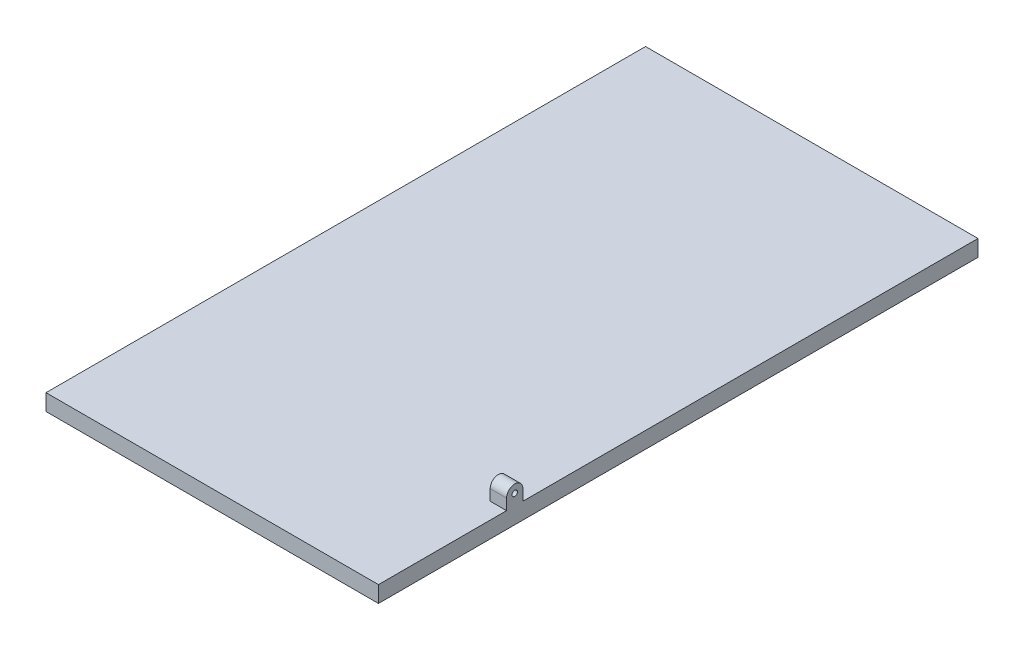
ISO-10303-21;
HEADER;
FILE_DESCRIPTION(('STEP AP214'),'2;1');
FILE_NAME('part.step','',(''),(''),'','','');
FILE_SCHEMA(('AUTOMOTIVE_DESIGN { 1 0 10303 214 1 1 1 1 }'));
ENDSEC;
DATA;
#1=APPLICATION_CONTEXT('core data for automotive mechanical design processes');
#2=APPLICATION_PROTOCOL_DEFINITION('international standard','automotive_design',2000,#1);
#3=PRODUCT_CONTEXT('',#1,'mechanical');
#4=PRODUCT('Part','Part','',(#3));
#5=PRODUCT_RELATED_PRODUCT_CATEGORY('part','',(#4));
#6=PRODUCT_DEFINITION_FORMATION('','',#4);
#7=PRODUCT_DEFINITION_CONTEXT('part definition',#1,'design');
#8=PRODUCT_DEFINITION('design','',#6,#7);
#9=PRODUCT_DEFINITION_SHAPE('','',#8);
#10=(LENGTH_UNIT() NAMED_UNIT(*) SI_UNIT(.MILLI.,.METRE.));
#11=(NAMED_UNIT(*) PLANE_ANGLE_UNIT() SI_UNIT($,.RADIAN.));
#12=(NAMED_UNIT(*) SI_UNIT($,.STERADIAN.) SOLID_ANGLE_UNIT());
#13=UNCERTAINTY_MEASURE_WITH_UNIT(LENGTH_MEASURE(1.E-05),#10,'distance_accuracy_value','');
#14=(GEOMETRIC_REPRESENTATION_CONTEXT(3) GLOBAL_UNCERTAINTY_ASSIGNED_CONTEXT((#13)) GLOBAL_UNIT_ASSIGNED_CONTEXT((#10,
#11,#12)) REPRESENTATION_CONTEXT('',''));
#15=CARTESIAN_POINT('',(0.,0.,0.));
#16=DIRECTION('',(0.,0.,1.));
#17=DIRECTION('',(1.,0.,0.));
#18=AXIS2_PLACEMENT_3D('',#15,#16,#17);
#19=CARTESIAN_POINT('',(0.,3.,0.));
#20=DIRECTION('',(0.,-1.,0.));
#21=DIRECTION('',(0.,0.,-1.));
#22=AXIS2_PLACEMENT_3D('',#19,#20,#21);
#23=PLANE('',#22);
#24=DIRECTION('',(1.,0.,0.));
#25=VECTOR('',#24,1.);
#26=CARTESIAN_POINT('',(58.,3.,-13.5));
#27=LINE('',#26,#25);
#28=CARTESIAN_POINT('',(58.,3.,-13.5));
#29=VERTEX_POINT('',#28);
#30=CARTESIAN_POINT('',(61.,3.,-13.5));
#31=VERTEX_POINT('',#30);
#32=EDGE_CURVE('E127',#29,#31,#27,.T.);
#33=ORIENTED_EDGE('',*,*,#32,.F.);
#34=DIRECTION('',(0.,0.,-1.));
#35=VECTOR('',#34,1.);
#36=CARTESIAN_POINT('',(58.,3.,-13.5));
#37=LINE('',#36,#35);
#38=CARTESIAN_POINT('',(58.,3.,-16.5));
#39=VERTEX_POINT('',#38);
#40=EDGE_CURVE('E153',#29,#39,#37,.T.);
#41=ORIENTED_EDGE('',*,*,#40,.T.);
#42=DIRECTION('',(1.,0.,0.));
#43=VECTOR('',#42,1.);
#44=CARTESIAN_POINT('',(58.,3.,-16.5));
#45=LINE('',#44,#43);
#46=CARTESIAN_POINT('',(61.,3.,-16.5));
#47=VERTEX_POINT('',#46);
#48=EDGE_CURVE('E124',#39,#47,#45,.T.);
#49=ORIENTED_EDGE('',*,*,#48,.T.);
#50=DIRECTION('',(0.,0.,-1.));
#51=VECTOR('',#50,1.);
#52=CARTESIAN_POINT('',(61.,3.,0.));
#53=LINE('',#52,#51);
#54=CARTESIAN_POINT('',(61.,3.,-100.));
#55=VERTEX_POINT('',#54);
#56=EDGE_CURVE('E107',#47,#55,#53,.T.);
#57=ORIENTED_EDGE('',*,*,#56,.T.);
#58=DIRECTION('',(-1.,0.,0.));
#59=VECTOR('',#58,1.);
#60=CARTESIAN_POINT('',(0.,3.,-100.));
#61=LINE('',#60,#59);
#62=CARTESIAN_POINT('',(0.,3.,-100.));
#63=VERTEX_POINT('',#62);
#64=EDGE_CURVE('E61',#55,#63,#61,.T.);
#65=ORIENTED_EDGE('',*,*,#64,.T.);
#66=DIRECTION('',(0.,0.,1.));
#67=VECTOR('',#66,1.);
#68=CARTESIAN_POINT('',(0.,3.,0.));
#69=LINE('',#68,#67);
#70=CARTESIAN_POINT('',(0.,3.,10.));
#71=VERTEX_POINT('',#70);
#72=EDGE_CURVE('E81',#63,#71,#69,.T.);
#73=ORIENTED_EDGE('',*,*,#72,.T.);
#74=DIRECTION('',(-1.,0.,0.));
#75=VECTOR('',#74,1.);
#76=CARTESIAN_POINT('',(0.,3.,10.));
#77=LINE('',#76,#75);
#78=CARTESIAN_POINT('',(61.,3.,10.));
#79=VERTEX_POINT('',#78);
#80=EDGE_CURVE('E95',#79,#71,#77,.T.);
#81=ORIENTED_EDGE('',*,*,#80,.F.);
#82=EDGE_CURVE('E104',#79,#31,#53,.T.);
#83=ORIENTED_EDGE('',*,*,#82,.T.);
#84=EDGE_LOOP('',(#33,#41,#49,#57,#65,#73,#81,#83));
#85=FACE_BOUND('',#84,.T.);
#86=ADVANCED_FACE('F35',(#85),#23,.F.);
#87=CARTESIAN_POINT('',(0.,3.,0.));
#88=DIRECTION('',(1.,0.,0.));
#89=DIRECTION('',(0.,0.,-1.));
#90=AXIS2_PLACEMENT_3D('',#87,#88,#89);
#91=PLANE('',#90);
#92=DIRECTION('',(0.,0.,1.));
#93=VECTOR('',#92,1.);
#94=CARTESIAN_POINT('',(0.,0.,0.));
#95=LINE('',#94,#93);
#96=CARTESIAN_POINT('',(0.,0.,-100.));
#97=VERTEX_POINT('',#96);
#98=CARTESIAN_POINT('',(0.,0.,10.));
#99=VERTEX_POINT('',#98);
#100=EDGE_CURVE('E88',#97,#99,#95,.T.);
#101=ORIENTED_EDGE('',*,*,#100,.T.);
#102=DIRECTION('',(0.,-1.,0.));
#103=VECTOR('',#102,1.);
#104=CARTESIAN_POINT('',(0.,0.,10.));
#105=LINE('',#104,#103);
#106=EDGE_CURVE('E116',#71,#99,#105,.T.);
#107=ORIENTED_EDGE('',*,*,#106,.F.);
#108=ORIENTED_EDGE('',*,*,#72,.F.);
#109=DIRECTION('',(0.,-1.,0.));
#110=VECTOR('',#109,1.);
#111=CARTESIAN_POINT('',(0.,3.,-100.));
#112=LINE('',#111,#110);
#113=EDGE_CURVE('E44',#63,#97,#112,.T.);
#114=ORIENTED_EDGE('',*,*,#113,.T.);
#115=EDGE_LOOP('',(#101,#107,#108,#114));
#116=FACE_BOUND('',#115,.T.);
#117=ADVANCED_FACE('F37',(#116),#91,.F.);
#118=CARTESIAN_POINT('',(61.,3.,0.));
#119=DIRECTION('',(-1.,0.,0.));
#120=DIRECTION('',(0.,0.,1.));
#121=AXIS2_PLACEMENT_3D('',#118,#119,#120);
#122=PLANE('',#121);
#123=DIRECTION('',(0.,0.,-1.));
#124=VECTOR('',#123,1.);
#125=CARTESIAN_POINT('',(61.,0.,0.));
#126=LINE('',#125,#124);
#127=CARTESIAN_POINT('',(61.,0.,10.));
#128=VERTEX_POINT('',#127);
#129=CARTESIAN_POINT('',(61.,0.,-100.));
#130=VERTEX_POINT('',#129);
#131=EDGE_CURVE('E82',#128,#130,#126,.T.);
#132=ORIENTED_EDGE('',*,*,#131,.T.);
#133=DIRECTION('',(0.,-1.,0.));
#134=VECTOR('',#133,1.);
#135=CARTESIAN_POINT('',(61.,3.,-100.));
#136=LINE('',#135,#134);
#137=EDGE_CURVE('E11',#55,#130,#136,.T.);
#138=ORIENTED_EDGE('',*,*,#137,.F.);
#139=ORIENTED_EDGE('',*,*,#56,.F.);
#140=DIRECTION('',(0.,1.,0.));
#141=VECTOR('',#140,1.);
#142=CARTESIAN_POINT('',(61.,3.,-16.5));
#143=LINE('',#142,#141);
#144=CARTESIAN_POINT('',(61.,5.,-16.5));
#145=VERTEX_POINT('',#144);
#146=EDGE_CURVE('E52',#47,#145,#143,.T.);
#147=ORIENTED_EDGE('',*,*,#146,.T.);
#148=CARTESIAN_POINT('',(61.,5.,-15.));
#149=DIRECTION('',(1.,0.,0.));
#150=DIRECTION('',(0.,0.,1.));
#151=AXIS2_PLACEMENT_3D('',#148,#149,#150);
#152=CIRCLE('',#151,1.5);
#153=CARTESIAN_POINT('',(61.,5.,-13.5));
#154=VERTEX_POINT('',#153);
#155=EDGE_CURVE('E141',#145,#154,#152,.T.);
#156=ORIENTED_EDGE('',*,*,#155,.T.);
#157=DIRECTION('',(0.,-1.,0.));
#158=VECTOR('',#157,1.);
#159=CARTESIAN_POINT('',(61.,3.,-13.5));
#160=LINE('',#159,#158);
#161=EDGE_CURVE('E133',#154,#31,#160,.T.);
#162=ORIENTED_EDGE('',*,*,#161,.T.);
#163=ORIENTED_EDGE('',*,*,#82,.F.);
#164=DIRECTION('',(0.,1.,0.));
#165=VECTOR('',#164,1.);
#166=CARTESIAN_POINT('',(61.,0.,10.));
#167=LINE('',#166,#165);
#168=EDGE_CURVE('E99',#128,#79,#167,.T.);
#169=ORIENTED_EDGE('',*,*,#168,.F.);
#170=EDGE_LOOP('',(#132,#138,#139,#147,#156,#162,#163,#169));
#171=FACE_BOUND('',#170,.T.);
#172=CARTESIAN_POINT('',(61.,5.,-15.));
#173=DIRECTION('',(1.,0.,0.));
#174=DIRECTION('',(0.,0.,1.));
#175=AXIS2_PLACEMENT_3D('',#172,#173,#174);
#176=CIRCLE('',#175,0.500000000000001);
#177=CARTESIAN_POINT('',(61.,5.,-14.5));
#178=VERTEX_POINT('',#177);
#179=EDGE_CURVE('E143',#178,#178,#176,.T.);
#180=ORIENTED_EDGE('',*,*,#179,.F.);
#181=EDGE_LOOP('',(#180));
#182=FACE_BOUND('',#181,.T.);
#183=ADVANCED_FACE('F174',(#171,#182),#122,.F.);
#184=CARTESIAN_POINT('',(0.,3.,-100.));
#185=DIRECTION('',(0.,0.,1.));
#186=DIRECTION('',(1.,0.,0.));
#187=AXIS2_PLACEMENT_3D('',#184,#185,#186);
#188=PLANE('',#187);
#189=DIRECTION('',(-1.,0.,0.));
#190=VECTOR('',#189,1.);
#191=CARTESIAN_POINT('',(0.,0.,-100.));
#192=LINE('',#191,#190);
#193=EDGE_CURVE('E73',#130,#97,#192,.T.);
#194=ORIENTED_EDGE('',*,*,#193,.T.);
#195=ORIENTED_EDGE('',*,*,#113,.F.);
#196=ORIENTED_EDGE('',*,*,#64,.F.);
#197=ORIENTED_EDGE('',*,*,#137,.T.);
#198=EDGE_LOOP('',(#194,#195,#196,#197));
#199=FACE_BOUND('',#198,.T.);
#200=ADVANCED_FACE('F75',(#199),#188,.F.);
#201=CARTESIAN_POINT('',(0.,0.,0.));
#202=DIRECTION('',(0.,-1.,0.));
#203=DIRECTION('',(0.,0.,-1.));
#204=AXIS2_PLACEMENT_3D('',#201,#202,#203);
#205=PLANE('',#204);
#206=ORIENTED_EDGE('',*,*,#100,.F.);
#207=ORIENTED_EDGE('',*,*,#193,.F.);
#208=ORIENTED_EDGE('',*,*,#131,.F.);
#209=DIRECTION('',(1.,0.,0.));
#210=VECTOR('',#209,1.);
#211=CARTESIAN_POINT('',(0.,0.,10.));
#212=LINE('',#211,#210);
#213=EDGE_CURVE('E93',#99,#128,#212,.T.);
#214=ORIENTED_EDGE('',*,*,#213,.F.);
#215=EDGE_LOOP('',(#206,#207,#208,#214));
#216=FACE_BOUND('',#215,.T.);
#217=ADVANCED_FACE('F91',(#216),#205,.T.);
#218=CARTESIAN_POINT('',(0.,0.,10.));
#219=DIRECTION('',(0.,0.,-1.));
#220=DIRECTION('',(-1.,0.,0.));
#221=AXIS2_PLACEMENT_3D('',#218,#219,#220);
#222=PLANE('',#221);
#223=ORIENTED_EDGE('',*,*,#106,.T.);
#224=ORIENTED_EDGE('',*,*,#213,.T.);
#225=ORIENTED_EDGE('',*,*,#168,.T.);
#226=ORIENTED_EDGE('',*,*,#80,.T.);
#227=EDGE_LOOP('',(#223,#224,#225,#226));
#228=FACE_BOUND('',#227,.T.);
#229=ADVANCED_FACE('F186',(#228),#222,.F.);
#230=CARTESIAN_POINT('',(58.,3.,-13.5));
#231=DIRECTION('',(0.,0.,1.));
#232=DIRECTION('',(1.,0.,0.));
#233=AXIS2_PLACEMENT_3D('',#230,#231,#232);
#234=PLANE('',#233);
#235=ORIENTED_EDGE('',*,*,#161,.F.);
#236=DIRECTION('',(1.,0.,0.));
#237=VECTOR('',#236,1.);
#238=CARTESIAN_POINT('',(58.,5.,-13.5));
#239=LINE('',#238,#237);
#240=CARTESIAN_POINT('',(58.,5.,-13.5));
#241=VERTEX_POINT('',#240);
#242=EDGE_CURVE('E118',#241,#154,#239,.T.);
#243=ORIENTED_EDGE('',*,*,#242,.F.);
#244=DIRECTION('',(0.,-1.,0.));
#245=VECTOR('',#244,1.);
#246=CARTESIAN_POINT('',(58.,3.,-13.5));
#247=LINE('',#246,#245);
#248=EDGE_CURVE('E150',#241,#29,#247,.T.);
#249=ORIENTED_EDGE('',*,*,#248,.T.);
#250=ORIENTED_EDGE('',*,*,#32,.T.);
#251=EDGE_LOOP('',(#235,#243,#249,#250));
#252=FACE_BOUND('',#251,.T.);
#253=ADVANCED_FACE('F178',(#252),#234,.T.);
#254=CARTESIAN_POINT('',(58.,5.,-15.));
#255=DIRECTION('',(1.,0.,0.));
#256=DIRECTION('',(0.,0.,-1.));
#257=AXIS2_PLACEMENT_3D('',#254,#255,#256);
#258=CYLINDRICAL_SURFACE('',#257,1.5);
#259=ORIENTED_EDGE('',*,*,#155,.F.);
#260=DIRECTION('',(1.,0.,0.));
#261=VECTOR('',#260,1.);
#262=CARTESIAN_POINT('',(58.,5.,-16.5));
#263=LINE('',#262,#261);
#264=CARTESIAN_POINT('',(58.,5.,-16.5));
#265=VERTEX_POINT('',#264);
#266=EDGE_CURVE('E121',#265,#145,#263,.T.);
#267=ORIENTED_EDGE('',*,*,#266,.F.);
#268=CARTESIAN_POINT('',(58.,5.,-15.));
#269=DIRECTION('',(1.,0.,0.));
#270=DIRECTION('',(0.,0.,1.));
#271=AXIS2_PLACEMENT_3D('',#268,#269,#270);
#272=CIRCLE('',#271,1.5);
#273=EDGE_CURVE('E131',#265,#241,#272,.T.);
#274=ORIENTED_EDGE('',*,*,#273,.T.);
#275=ORIENTED_EDGE('',*,*,#242,.T.);
#276=EDGE_LOOP('',(#259,#267,#274,#275));
#277=FACE_BOUND('',#276,.T.);
#278=ADVANCED_FACE('F176',(#277),#258,.T.);
#279=CARTESIAN_POINT('',(58.,3.,-16.5));
#280=DIRECTION('',(0.,0.,-1.));
#281=DIRECTION('',(0.,1.,0.));
#282=AXIS2_PLACEMENT_3D('',#279,#280,#281);
#283=PLANE('',#282);
#284=ORIENTED_EDGE('',*,*,#146,.F.);
#285=ORIENTED_EDGE('',*,*,#48,.F.);
#286=DIRECTION('',(0.,1.,0.));
#287=VECTOR('',#286,1.);
#288=CARTESIAN_POINT('',(58.,3.,-16.5));
#289=LINE('',#288,#287);
#290=EDGE_CURVE('E156',#39,#265,#289,.T.);
#291=ORIENTED_EDGE('',*,*,#290,.T.);
#292=ORIENTED_EDGE('',*,*,#266,.T.);
#293=EDGE_LOOP('',(#284,#285,#291,#292));
#294=FACE_BOUND('',#293,.T.);
#295=ADVANCED_FACE('F168',(#294),#283,.T.);
#296=CARTESIAN_POINT('',(58.,5.,-15.));
#297=DIRECTION('',(-1.,0.,0.));
#298=DIRECTION('',(0.,0.,1.));
#299=AXIS2_PLACEMENT_3D('',#296,#297,#298);
#300=PLANE('',#299);
#301=CARTESIAN_POINT('',(58.,5.,-15.));
#302=DIRECTION('',(1.,0.,0.));
#303=DIRECTION('',(0.,0.,1.));
#304=AXIS2_PLACEMENT_3D('',#301,#302,#303);
#305=CIRCLE('',#304,0.500000000000001);
#306=CARTESIAN_POINT('',(58.,5.,-14.5));
#307=VERTEX_POINT('',#306);
#308=EDGE_CURVE('E135',#307,#307,#305,.T.);
#309=ORIENTED_EDGE('',*,*,#308,.T.);
#310=EDGE_LOOP('',(#309));
#311=FACE_BOUND('',#310,.T.);
#312=ORIENTED_EDGE('',*,*,#248,.F.);
#313=ORIENTED_EDGE('',*,*,#273,.F.);
#314=ORIENTED_EDGE('',*,*,#290,.F.);
#315=ORIENTED_EDGE('',*,*,#40,.F.);
#316=EDGE_LOOP('',(#312,#313,#314,#315));
#317=FACE_BOUND('',#316,.T.);
#318=ADVANCED_FACE('F184',(#311,#317),#300,.T.);
#319=CARTESIAN_POINT('',(58.,5.,-15.));
#320=DIRECTION('',(1.,0.,0.));
#321=DIRECTION('',(0.,0.,-1.));
#322=AXIS2_PLACEMENT_3D('',#319,#320,#321);
#323=CYLINDRICAL_SURFACE('',#322,0.500000000000001);
#324=ORIENTED_EDGE('',*,*,#308,.F.);
#325=EDGE_LOOP('',(#324));
#326=FACE_BOUND('',#325,.T.);
#327=ORIENTED_EDGE('',*,*,#179,.T.);
#328=EDGE_LOOP('',(#327));
#329=FACE_BOUND('',#328,.T.);
#330=ADVANCED_FACE('F243',(#326,#329),#323,.F.);
#331=CLOSED_SHELL('',(#86,#117,#183,#200,#217,#229,#253,#278,#295,#318,#330));
#332=MANIFOLD_SOLID_BREP('B2',#331);
#333=ADVANCED_BREP_SHAPE_REPRESENTATION('',(#18,#332),#14);
#334=SHAPE_DEFINITION_REPRESENTATION(#9,#333);
ENDSEC;
END-ISO-10303-21;
